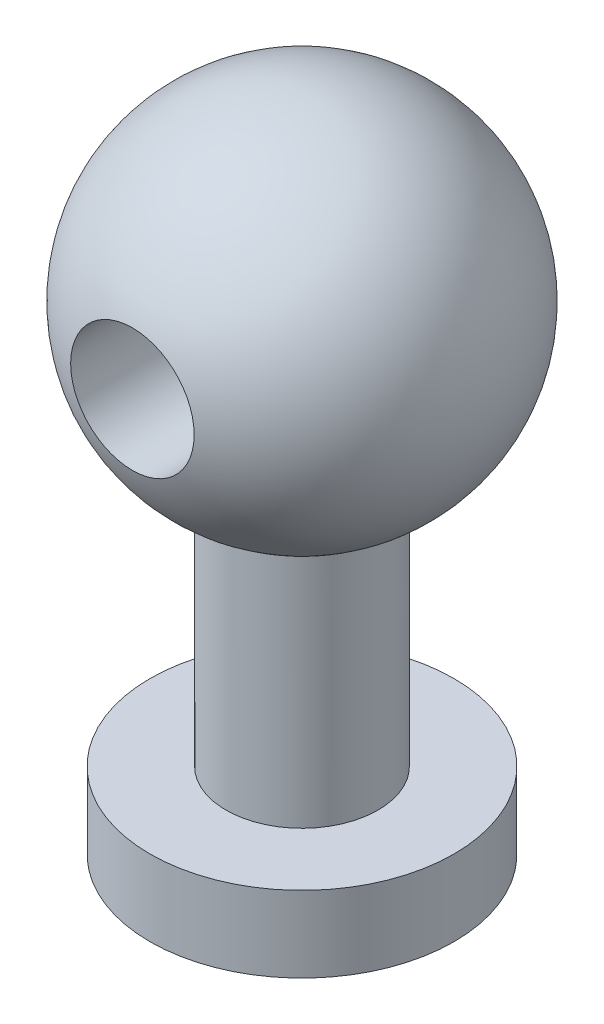
ISO-10303-21;
HEADER;
FILE_DESCRIPTION(('STEP AP214'),'2;1');
FILE_NAME('part.step','',(''),(''),'','','');
FILE_SCHEMA(('AUTOMOTIVE_DESIGN { 1 0 10303 214 1 1 1 1 }'));
ENDSEC;
DATA;
#1=APPLICATION_CONTEXT('core data for automotive mechanical design processes');
#2=APPLICATION_PROTOCOL_DEFINITION('international standard','automotive_design',2000,#1);
#3=PRODUCT_CONTEXT('',#1,'mechanical');
#4=PRODUCT('Part','Part','',(#3));
#5=PRODUCT_RELATED_PRODUCT_CATEGORY('part','',(#4));
#6=PRODUCT_DEFINITION_FORMATION('','',#4);
#7=PRODUCT_DEFINITION_CONTEXT('part definition',#1,'design');
#8=PRODUCT_DEFINITION('design','',#6,#7);
#9=PRODUCT_DEFINITION_SHAPE('','',#8);
#10=(LENGTH_UNIT() NAMED_UNIT(*) SI_UNIT(.MILLI.,.METRE.));
#11=(NAMED_UNIT(*) PLANE_ANGLE_UNIT() SI_UNIT($,.RADIAN.));
#12=(NAMED_UNIT(*) SI_UNIT($,.STERADIAN.) SOLID_ANGLE_UNIT());
#13=UNCERTAINTY_MEASURE_WITH_UNIT(LENGTH_MEASURE(1.E-05),#10,'distance_accuracy_value','');
#14=(GEOMETRIC_REPRESENTATION_CONTEXT(3) GLOBAL_UNCERTAINTY_ASSIGNED_CONTEXT((#13)) GLOBAL_UNIT_ASSIGNED_CONTEXT((#10,
#11,#12)) REPRESENTATION_CONTEXT('',''));
#15=CARTESIAN_POINT('',(0.,0.,0.));
#16=DIRECTION('',(0.,0.,1.));
#17=DIRECTION('',(1.,0.,0.));
#18=AXIS2_PLACEMENT_3D('',#15,#16,#17);
#19=CARTESIAN_POINT('',(0.,0.,0.));
#20=DIRECTION('',(0.,-1.,0.));
#21=DIRECTION('',(0.,0.,-1.));
#22=AXIS2_PLACEMENT_3D('',#19,#20,#21);
#23=PLANE('',#22);
#24=CARTESIAN_POINT('',(0.,0.,0.));
#25=DIRECTION('',(0.,-1.,0.));
#26=DIRECTION('',(0.,0.,-1.));
#27=AXIS2_PLACEMENT_3D('',#24,#25,#26);
#28=CIRCLE('',#27,8.);
#29=CARTESIAN_POINT('',(0.,0.,-8.));
#30=VERTEX_POINT('',#29);
#31=EDGE_CURVE('E10',#30,#30,#28,.T.);
#32=ORIENTED_EDGE('',*,*,#31,.T.);
#33=EDGE_LOOP('',(#32));
#34=FACE_BOUND('',#33,.T.);
#35=ADVANCED_FACE('F39',(#34),#23,.T.);
#36=CARTESIAN_POINT('',(0.,0.,0.));
#37=DIRECTION('',(0.,-1.,0.));
#38=DIRECTION('',(0.,0.,-1.));
#39=AXIS2_PLACEMENT_3D('',#36,#37,#38);
#40=CYLINDRICAL_SURFACE('',#39,8.);
#41=CARTESIAN_POINT('',(0.,4.,0.));
#42=DIRECTION('',(0.,-1.,0.));
#43=DIRECTION('',(0.,0.,-1.));
#44=AXIS2_PLACEMENT_3D('',#41,#42,#43);
#45=CIRCLE('',#44,8.);
#46=CARTESIAN_POINT('',(0.,4.,-8.));
#47=VERTEX_POINT('',#46);
#48=EDGE_CURVE('E46',#47,#47,#45,.T.);
#49=ORIENTED_EDGE('',*,*,#48,.T.);
#50=EDGE_LOOP('',(#49));
#51=FACE_BOUND('',#50,.T.);
#52=ORIENTED_EDGE('',*,*,#31,.F.);
#53=EDGE_LOOP('',(#52));
#54=FACE_BOUND('',#53,.T.);
#55=ADVANCED_FACE('F83',(#51,#54),#40,.T.);
#56=CARTESIAN_POINT('',(8.,4.,0.));
#57=DIRECTION('',(0.,1.,0.));
#58=DIRECTION('',(0.,0.,1.));
#59=AXIS2_PLACEMENT_3D('',#56,#57,#58);
#60=PLANE('',#59);
#61=CARTESIAN_POINT('',(0.,4.,0.));
#62=DIRECTION('',(0.,-1.,0.));
#63=DIRECTION('',(0.,0.,-1.));
#64=AXIS2_PLACEMENT_3D('',#61,#62,#63);
#65=CIRCLE('',#64,4.);
#66=CARTESIAN_POINT('',(0.,4.,-4.));
#67=VERTEX_POINT('',#66);
#68=EDGE_CURVE('E51',#67,#67,#65,.T.);
#69=ORIENTED_EDGE('',*,*,#68,.T.);
#70=EDGE_LOOP('',(#69));
#71=FACE_BOUND('',#70,.T.);
#72=ORIENTED_EDGE('',*,*,#48,.F.);
#73=EDGE_LOOP('',(#72));
#74=FACE_BOUND('',#73,.T.);
#75=ADVANCED_FACE('F67',(#71,#74),#60,.T.);
#76=CARTESIAN_POINT('',(0.,0.,0.));
#77=DIRECTION('',(0.,-1.,0.));
#78=DIRECTION('',(0.,0.,-1.));
#79=AXIS2_PLACEMENT_3D('',#76,#77,#78);
#80=CYLINDRICAL_SURFACE('',#79,4.);
#81=CARTESIAN_POINT('',(0.,16.583156030193,0.));
#82=DIRECTION('',(0.,-1.,0.));
#83=DIRECTION('',(0.,0.,-1.));
#84=AXIS2_PLACEMENT_3D('',#81,#82,#83);
#85=CIRCLE('',#84,4.);
#86=CARTESIAN_POINT('',(0.,16.583156030193,-4.));
#87=VERTEX_POINT('',#86);
#88=EDGE_CURVE('E56',#87,#87,#85,.T.);
#89=ORIENTED_EDGE('',*,*,#88,.T.);
#90=EDGE_LOOP('',(#89));
#91=FACE_BOUND('',#90,.T.);
#92=ORIENTED_EDGE('',*,*,#68,.F.);
#93=EDGE_LOOP('',(#92));
#94=FACE_BOUND('',#93,.T.);
#95=ADVANCED_FACE('F75',(#91,#94),#80,.T.);
#96=CARTESIAN_POINT('',(0.,25.2,0.));
#97=DIRECTION('',(0.,-1.,0.));
#98=DIRECTION('',(1.,0.,0.));
#99=AXIS2_PLACEMENT_3D('',#96,#97,#98);
#100=SPHERICAL_SURFACE('',#99,9.5);
#101=CARTESIAN_POINT('',(0.,25.2,8.92678553567856));
#102=DIRECTION('',(0.,0.,-1.));
#103=DIRECTION('',(-1.,0.,0.));
#104=AXIS2_PLACEMENT_3D('',#101,#102,#103);
#105=CIRCLE('',#104,3.25);
#106=CARTESIAN_POINT('',(-3.25,25.2,8.92678553567856));
#107=VERTEX_POINT('',#106);
#108=EDGE_CURVE('E45',#107,#107,#105,.F.);
#109=ORIENTED_EDGE('',*,*,#108,.F.);
#110=EDGE_LOOP('',(#109));
#111=FACE_BOUND('',#110,.T.);
#112=CARTESIAN_POINT('',(0.,25.2,-8.92678553567856));
#113=DIRECTION('',(0.,0.,1.));
#114=DIRECTION('',(1.,0.,0.));
#115=AXIS2_PLACEMENT_3D('',#112,#113,#114);
#116=CIRCLE('',#115,3.25);
#117=CARTESIAN_POINT('',(3.25,25.2,-8.92678553567856));
#118=VERTEX_POINT('',#117);
#119=EDGE_CURVE('E53',#118,#118,#116,.F.);
#120=ORIENTED_EDGE('',*,*,#119,.F.);
#121=EDGE_LOOP('',(#120));
#122=FACE_BOUND('',#121,.T.);
#123=ORIENTED_EDGE('',*,*,#88,.F.);
#124=EDGE_LOOP('',(#123));
#125=FACE_BOUND('',#124,.T.);
#126=ADVANCED_FACE('F74',(#111,#122,#125),#100,.T.);
#127=CARTESIAN_POINT('',(0.,25.2,-20.));
#128=DIRECTION('',(0.,0.,1.));
#129=DIRECTION('',(1.,0.,0.));
#130=AXIS2_PLACEMENT_3D('',#127,#128,#129);
#131=CYLINDRICAL_SURFACE('',#130,3.25);
#132=ORIENTED_EDGE('',*,*,#108,.T.);
#133=EDGE_LOOP('',(#132));
#134=FACE_BOUND('',#133,.T.);
#135=ORIENTED_EDGE('',*,*,#119,.T.);
#136=EDGE_LOOP('',(#135));
#137=FACE_BOUND('',#136,.T.);
#138=ADVANCED_FACE('F77',(#134,#137),#131,.F.);
#139=CLOSED_SHELL('',(#35,#55,#75,#95,#126,#138));
#140=MANIFOLD_SOLID_BREP('B2',#139);
#141=ADVANCED_BREP_SHAPE_REPRESENTATION('',(#18,#140),#14);
#142=SHAPE_DEFINITION_REPRESENTATION(#9,#141);
ENDSEC;
END-ISO-10303-21;
